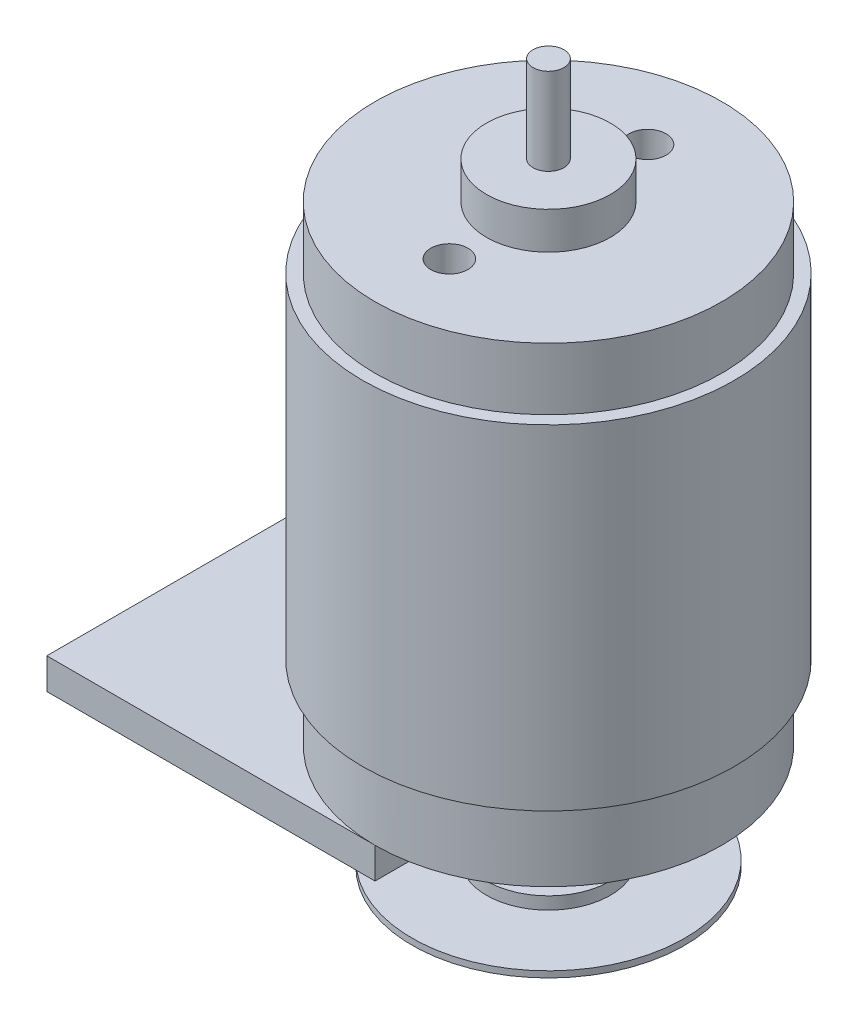
ISO-10303-21;
HEADER;
FILE_DESCRIPTION(('STEP AP214'),'2;1');
FILE_NAME('part.step','',(''),(''),'','','');
FILE_SCHEMA(('AUTOMOTIVE_DESIGN { 1 0 10303 214 1 1 1 1 }'));
ENDSEC;
DATA;
#1=APPLICATION_CONTEXT('core data for automotive mechanical design processes');
#2=APPLICATION_PROTOCOL_DEFINITION('international standard','automotive_design',2000,#1);
#3=PRODUCT_CONTEXT('',#1,'mechanical');
#4=PRODUCT('Part','Part','',(#3));
#5=PRODUCT_RELATED_PRODUCT_CATEGORY('part','',(#4));
#6=PRODUCT_DEFINITION_FORMATION('','',#4);
#7=PRODUCT_DEFINITION_CONTEXT('part definition',#1,'design');
#8=PRODUCT_DEFINITION('design','',#6,#7);
#9=PRODUCT_DEFINITION_SHAPE('','',#8);
#10=(LENGTH_UNIT() NAMED_UNIT(*) SI_UNIT(.MILLI.,.METRE.));
#11=(NAMED_UNIT(*) PLANE_ANGLE_UNIT() SI_UNIT($,.RADIAN.));
#12=(NAMED_UNIT(*) SI_UNIT($,.STERADIAN.) SOLID_ANGLE_UNIT());
#13=UNCERTAINTY_MEASURE_WITH_UNIT(LENGTH_MEASURE(1.E-05),#10,'distance_accuracy_value','');
#14=(GEOMETRIC_REPRESENTATION_CONTEXT(3) GLOBAL_UNCERTAINTY_ASSIGNED_CONTEXT((#13)) GLOBAL_UNIT_ASSIGNED_CONTEXT((#10,
#11,#12)) REPRESENTATION_CONTEXT('',''));
#15=CARTESIAN_POINT('',(0.,0.,0.));
#16=DIRECTION('',(0.,0.,1.));
#17=DIRECTION('',(1.,0.,0.));
#18=AXIS2_PLACEMENT_3D('',#15,#16,#17);
#19=CARTESIAN_POINT('',(0.,-6.,0.));
#20=DIRECTION('',(0.,-1.,0.));
#21=DIRECTION('',(0.,0.,-1.));
#22=AXIS2_PLACEMENT_3D('',#19,#20,#21);
#23=PLANE('',#22);
#24=CARTESIAN_POINT('',(0.,-6.,0.));
#25=DIRECTION('',(0.,-1.,0.));
#26=DIRECTION('',(0.,0.,-1.));
#27=AXIS2_PLACEMENT_3D('',#24,#25,#26);
#28=CIRCLE('',#27,14.);
#29=CARTESIAN_POINT('',(0.,-6.,-14.));
#30=VERTEX_POINT('',#29);
#31=CARTESIAN_POINT('',(0.,-6.,14.));
#32=VERTEX_POINT('',#31);
#33=EDGE_CURVE('E126',#30,#32,#28,.T.);
#34=ORIENTED_EDGE('',*,*,#33,.T.);
#35=DIRECTION('',(0.,0.,1.));
#36=VECTOR('',#35,1.);
#37=CARTESIAN_POINT('',(0.,-6.,14.));
#38=LINE('',#37,#36);
#39=CARTESIAN_POINT('',(0.,-6.,5.));
#40=VERTEX_POINT('',#39);
#41=EDGE_CURVE('E115',#40,#32,#38,.T.);
#42=ORIENTED_EDGE('',*,*,#41,.F.);
#43=CARTESIAN_POINT('',(0.,-6.,0.));
#44=DIRECTION('',(0.,-1.,0.));
#45=DIRECTION('',(0.,0.,-1.));
#46=AXIS2_PLACEMENT_3D('',#43,#44,#45);
#47=CIRCLE('',#46,5.);
#48=CARTESIAN_POINT('',(0.,-6.,-5.));
#49=VERTEX_POINT('',#48);
#50=EDGE_CURVE('E127',#49,#40,#47,.T.);
#51=ORIENTED_EDGE('',*,*,#50,.F.);
#52=EDGE_CURVE('E58',#30,#49,#38,.T.);
#53=ORIENTED_EDGE('',*,*,#52,.F.);
#54=EDGE_LOOP('',(#34,#42,#51,#53));
#55=FACE_BOUND('',#54,.T.);
#56=ADVANCED_FACE('F35',(#55),#23,.T.);
#57=CARTESIAN_POINT('',(0.,-9.,0.));
#58=DIRECTION('',(0.,1.,0.));
#59=DIRECTION('',(0.,0.,1.));
#60=AXIS2_PLACEMENT_3D('',#57,#58,#59);
#61=CYLINDRICAL_SURFACE('',#60,5.);
#62=CARTESIAN_POINT('',(0.,-9.,0.));
#63=DIRECTION('',(0.,-1.,0.));
#64=DIRECTION('',(0.,0.,-1.));
#65=AXIS2_PLACEMENT_3D('',#62,#63,#64);
#66=CIRCLE('',#65,5.);
#67=CARTESIAN_POINT('',(0.,-9.,-5.));
#68=VERTEX_POINT('',#67);
#69=EDGE_CURVE('E118',#68,#68,#66,.T.);
#70=ORIENTED_EDGE('',*,*,#69,.F.);
#71=EDGE_LOOP('',(#70));
#72=FACE_BOUND('',#71,.T.);
#73=DIRECTION('',(0.,1.,0.));
#74=VECTOR('',#73,1.);
#75=CARTESIAN_POINT('',(0.,-9.,5.));
#76=LINE('',#75,#74);
#77=CARTESIAN_POINT('',(0.,-8.5,5.));
#78=VERTEX_POINT('',#77);
#79=EDGE_CURVE('E39',#78,#40,#76,.T.);
#80=ORIENTED_EDGE('',*,*,#79,.F.);
#81=CARTESIAN_POINT('',(0.,-8.5,0.));
#82=DIRECTION('',(0.,1.,0.));
#83=DIRECTION('',(0.,0.,1.));
#84=AXIS2_PLACEMENT_3D('',#81,#82,#83);
#85=CIRCLE('',#84,5.);
#86=CARTESIAN_POINT('',(0.,-8.5,-5.));
#87=VERTEX_POINT('',#86);
#88=EDGE_CURVE('E97',#87,#78,#85,.T.);
#89=ORIENTED_EDGE('',*,*,#88,.F.);
#90=DIRECTION('',(0.,1.,0.));
#91=VECTOR('',#90,1.);
#92=CARTESIAN_POINT('',(0.,-9.,-5.));
#93=LINE('',#92,#91);
#94=EDGE_CURVE('E158',#49,#87,#93,.F.);
#95=ORIENTED_EDGE('',*,*,#94,.F.);
#96=ORIENTED_EDGE('',*,*,#50,.T.);
#97=EDGE_LOOP('',(#80,#89,#95,#96));
#98=FACE_BOUND('',#97,.T.);
#99=ADVANCED_FACE('F208',(#72,#98),#61,.T.);
#100=CARTESIAN_POINT('',(0.,27.,0.));
#101=DIRECTION('',(0.,-1.,0.));
#102=DIRECTION('',(0.,0.,-1.));
#103=AXIS2_PLACEMENT_3D('',#100,#101,#102);
#104=CYLINDRICAL_SURFACE('',#103,15.);
#105=CARTESIAN_POINT('',(0.,27.,0.));
#106=DIRECTION('',(0.,1.,0.));
#107=DIRECTION('',(0.,0.,1.));
#108=AXIS2_PLACEMENT_3D('',#105,#106,#107);
#109=CIRCLE('',#108,15.);
#110=CARTESIAN_POINT('',(0.,27.,15.));
#111=VERTEX_POINT('',#110);
#112=EDGE_CURVE('E153',#111,#111,#109,.T.);
#113=ORIENTED_EDGE('',*,*,#112,.F.);
#114=EDGE_LOOP('',(#113));
#115=FACE_BOUND('',#114,.T.);
#116=CARTESIAN_POINT('',(0.,0.,0.));
#117=DIRECTION('',(0.,1.,0.));
#118=DIRECTION('',(0.,0.,1.));
#119=AXIS2_PLACEMENT_3D('',#116,#117,#118);
#120=CIRCLE('',#119,15.);
#121=CARTESIAN_POINT('',(0.,0.,15.));
#122=VERTEX_POINT('',#121);
#123=EDGE_CURVE('E150',#122,#122,#120,.T.);
#124=ORIENTED_EDGE('',*,*,#123,.T.);
#125=EDGE_LOOP('',(#124));
#126=FACE_BOUND('',#125,.T.);
#127=ADVANCED_FACE('F37',(#115,#126),#104,.T.);
#128=CARTESIAN_POINT('',(0.,27.,0.));
#129=DIRECTION('',(0.,1.,0.));
#130=DIRECTION('',(0.,0.,1.));
#131=AXIS2_PLACEMENT_3D('',#128,#129,#130);
#132=PLANE('',#131);
#133=CARTESIAN_POINT('',(0.,27.,0.));
#134=DIRECTION('',(0.,1.,0.));
#135=DIRECTION('',(0.,0.,1.));
#136=AXIS2_PLACEMENT_3D('',#133,#134,#135);
#137=CIRCLE('',#136,14.);
#138=CARTESIAN_POINT('',(0.,27.,14.));
#139=VERTEX_POINT('',#138);
#140=EDGE_CURVE('E147',#139,#139,#137,.T.);
#141=ORIENTED_EDGE('',*,*,#140,.F.);
#142=EDGE_LOOP('',(#141));
#143=FACE_BOUND('',#142,.T.);
#144=ORIENTED_EDGE('',*,*,#112,.T.);
#145=EDGE_LOOP('',(#144));
#146=FACE_BOUND('',#145,.T.);
#147=ADVANCED_FACE('F244',(#143,#146),#132,.T.);
#148=CARTESIAN_POINT('',(0.,0.,0.));
#149=DIRECTION('',(0.,1.,0.));
#150=DIRECTION('',(0.,0.,1.));
#151=AXIS2_PLACEMENT_3D('',#148,#149,#150);
#152=PLANE('',#151);
#153=CARTESIAN_POINT('',(0.,0.,0.));
#154=DIRECTION('',(0.,-1.,0.));
#155=DIRECTION('',(0.,0.,-1.));
#156=AXIS2_PLACEMENT_3D('',#153,#154,#155);
#157=CIRCLE('',#156,14.);
#158=CARTESIAN_POINT('',(0.,0.,-14.));
#159=VERTEX_POINT('',#158);
#160=EDGE_CURVE('E130',#159,#159,#157,.T.);
#161=ORIENTED_EDGE('',*,*,#160,.F.);
#162=EDGE_LOOP('',(#161));
#163=FACE_BOUND('',#162,.T.);
#164=ORIENTED_EDGE('',*,*,#123,.F.);
#165=EDGE_LOOP('',(#164));
#166=FACE_BOUND('',#165,.T.);
#167=ADVANCED_FACE('F242',(#163,#166),#152,.F.);
#168=CARTESIAN_POINT('',(0.,32.,0.));
#169=DIRECTION('',(0.,-1.,0.));
#170=DIRECTION('',(0.,0.,-1.));
#171=AXIS2_PLACEMENT_3D('',#168,#169,#170);
#172=CYLINDRICAL_SURFACE('',#171,14.);
#173=CARTESIAN_POINT('',(0.,32.,0.));
#174=DIRECTION('',(0.,1.,0.));
#175=DIRECTION('',(0.,0.,1.));
#176=AXIS2_PLACEMENT_3D('',#173,#174,#175);
#177=CIRCLE('',#176,14.);
#178=CARTESIAN_POINT('',(0.,32.,14.));
#179=VERTEX_POINT('',#178);
#180=EDGE_CURVE('E144',#179,#179,#177,.T.);
#181=ORIENTED_EDGE('',*,*,#180,.F.);
#182=EDGE_LOOP('',(#181));
#183=FACE_BOUND('',#182,.T.);
#184=ORIENTED_EDGE('',*,*,#140,.T.);
#185=EDGE_LOOP('',(#184));
#186=FACE_BOUND('',#185,.T.);
#187=ADVANCED_FACE('F238',(#183,#186),#172,.T.);
#188=CARTESIAN_POINT('',(0.,32.,0.));
#189=DIRECTION('',(0.,1.,0.));
#190=DIRECTION('',(0.,0.,1.));
#191=AXIS2_PLACEMENT_3D('',#188,#189,#190);
#192=PLANE('',#191);
#193=CARTESIAN_POINT('',(0.,32.,-8.));
#194=DIRECTION('',(0.,1.,0.));
#195=DIRECTION('',(0.,0.,1.));
#196=AXIS2_PLACEMENT_3D('',#193,#194,#195);
#197=CIRCLE('',#196,1.5);
#198=CARTESIAN_POINT('',(0.,32.,-6.5));
#199=VERTEX_POINT('',#198);
#200=EDGE_CURVE('E525',#199,#199,#197,.T.);
#201=ORIENTED_EDGE('',*,*,#200,.F.);
#202=EDGE_LOOP('',(#201));
#203=FACE_BOUND('',#202,.T.);
#204=CARTESIAN_POINT('',(0.,32.,8.));
#205=DIRECTION('',(0.,1.,0.));
#206=DIRECTION('',(0.,0.,1.));
#207=AXIS2_PLACEMENT_3D('',#204,#205,#206);
#208=CIRCLE('',#207,1.5);
#209=CARTESIAN_POINT('',(0.,32.,9.5));
#210=VERTEX_POINT('',#209);
#211=EDGE_CURVE('E536',#210,#210,#208,.T.);
#212=ORIENTED_EDGE('',*,*,#211,.F.);
#213=EDGE_LOOP('',(#212));
#214=FACE_BOUND('',#213,.T.);
#215=CARTESIAN_POINT('',(0.,32.,0.));
#216=DIRECTION('',(0.,1.,0.));
#217=DIRECTION('',(0.,0.,1.));
#218=AXIS2_PLACEMENT_3D('',#215,#216,#217);
#219=CIRCLE('',#218,5.);
#220=CARTESIAN_POINT('',(0.,32.,5.));
#221=VERTEX_POINT('',#220);
#222=EDGE_CURVE('E141',#221,#221,#219,.T.);
#223=ORIENTED_EDGE('',*,*,#222,.F.);
#224=EDGE_LOOP('',(#223));
#225=FACE_BOUND('',#224,.T.);
#226=ORIENTED_EDGE('',*,*,#180,.T.);
#227=EDGE_LOOP('',(#226));
#228=FACE_BOUND('',#227,.T.);
#229=ADVANCED_FACE('F234',(#203,#214,#225,#228),#192,.T.);
#230=CARTESIAN_POINT('',(0.,35.,0.));
#231=DIRECTION('',(0.,-1.,0.));
#232=DIRECTION('',(0.,0.,-1.));
#233=AXIS2_PLACEMENT_3D('',#230,#231,#232);
#234=CYLINDRICAL_SURFACE('',#233,5.);
#235=CARTESIAN_POINT('',(0.,35.,0.));
#236=DIRECTION('',(0.,1.,0.));
#237=DIRECTION('',(0.,0.,1.));
#238=AXIS2_PLACEMENT_3D('',#235,#236,#237);
#239=CIRCLE('',#238,5.);
#240=CARTESIAN_POINT('',(0.,35.,5.));
#241=VERTEX_POINT('',#240);
#242=EDGE_CURVE('E138',#241,#241,#239,.T.);
#243=ORIENTED_EDGE('',*,*,#242,.F.);
#244=EDGE_LOOP('',(#243));
#245=FACE_BOUND('',#244,.T.);
#246=ORIENTED_EDGE('',*,*,#222,.T.);
#247=EDGE_LOOP('',(#246));
#248=FACE_BOUND('',#247,.T.);
#249=ADVANCED_FACE('F230',(#245,#248),#234,.T.);
#250=CARTESIAN_POINT('',(0.,35.,0.));
#251=DIRECTION('',(0.,1.,0.));
#252=DIRECTION('',(0.,0.,1.));
#253=AXIS2_PLACEMENT_3D('',#250,#251,#252);
#254=PLANE('',#253);
#255=CARTESIAN_POINT('',(0.,35.,0.));
#256=DIRECTION('',(0.,1.,0.));
#257=DIRECTION('',(0.,0.,1.));
#258=AXIS2_PLACEMENT_3D('',#255,#256,#257);
#259=CIRCLE('',#258,1.25);
#260=CARTESIAN_POINT('',(0.,35.,1.25));
#261=VERTEX_POINT('',#260);
#262=EDGE_CURVE('E135',#261,#261,#259,.T.);
#263=ORIENTED_EDGE('',*,*,#262,.F.);
#264=EDGE_LOOP('',(#263));
#265=FACE_BOUND('',#264,.T.);
#266=ORIENTED_EDGE('',*,*,#242,.T.);
#267=EDGE_LOOP('',(#266));
#268=FACE_BOUND('',#267,.T.);
#269=ADVANCED_FACE('F226',(#265,#268),#254,.T.);
#270=CARTESIAN_POINT('',(0.,42.,0.));
#271=DIRECTION('',(0.,-1.,0.));
#272=DIRECTION('',(0.,0.,-1.));
#273=AXIS2_PLACEMENT_3D('',#270,#271,#272);
#274=CYLINDRICAL_SURFACE('',#273,1.25);
#275=CARTESIAN_POINT('',(0.,42.,0.));
#276=DIRECTION('',(0.,1.,0.));
#277=DIRECTION('',(0.,0.,1.));
#278=AXIS2_PLACEMENT_3D('',#275,#276,#277);
#279=CIRCLE('',#278,1.25);
#280=CARTESIAN_POINT('',(0.,42.,1.25));
#281=VERTEX_POINT('',#280);
#282=EDGE_CURVE('E132',#281,#281,#279,.T.);
#283=ORIENTED_EDGE('',*,*,#282,.F.);
#284=EDGE_LOOP('',(#283));
#285=FACE_BOUND('',#284,.T.);
#286=ORIENTED_EDGE('',*,*,#262,.T.);
#287=EDGE_LOOP('',(#286));
#288=FACE_BOUND('',#287,.T.);
#289=ADVANCED_FACE('F222',(#285,#288),#274,.T.);
#290=CARTESIAN_POINT('',(0.,42.,0.));
#291=DIRECTION('',(0.,1.,0.));
#292=DIRECTION('',(0.,0.,1.));
#293=AXIS2_PLACEMENT_3D('',#290,#291,#292);
#294=PLANE('',#293);
#295=ORIENTED_EDGE('',*,*,#282,.T.);
#296=EDGE_LOOP('',(#295));
#297=FACE_BOUND('',#296,.T.);
#298=ADVANCED_FACE('F219',(#297),#294,.T.);
#299=CARTESIAN_POINT('',(0.,-6.,0.));
#300=DIRECTION('',(0.,1.,0.));
#301=DIRECTION('',(0.,0.,1.));
#302=AXIS2_PLACEMENT_3D('',#299,#300,#301);
#303=CYLINDRICAL_SURFACE('',#302,14.);
#304=ORIENTED_EDGE('',*,*,#33,.F.);
#305=CARTESIAN_POINT('',(0.,-6.,0.));
#306=DIRECTION('',(0.,1.,0.));
#307=DIRECTION('',(0.,0.,1.));
#308=AXIS2_PLACEMENT_3D('',#305,#306,#307);
#309=CIRCLE('',#308,14.);
#310=EDGE_CURVE('E51',#30,#32,#309,.T.);
#311=ORIENTED_EDGE('',*,*,#310,.T.);
#312=EDGE_LOOP('',(#304,#311));
#313=FACE_BOUND('',#312,.T.);
#314=ORIENTED_EDGE('',*,*,#160,.T.);
#315=EDGE_LOOP('',(#314));
#316=FACE_BOUND('',#315,.T.);
#317=ADVANCED_FACE('F216',(#313,#316),#303,.T.);
#318=CARTESIAN_POINT('',(0.,-9.,0.));
#319=DIRECTION('',(0.,-1.,0.));
#320=DIRECTION('',(0.,0.,-1.));
#321=AXIS2_PLACEMENT_3D('',#318,#319,#320);
#322=PLANE('',#321);
#323=CARTESIAN_POINT('',(0.,-9.,0.));
#324=DIRECTION('',(0.,-1.,0.));
#325=DIRECTION('',(0.,0.,-1.));
#326=AXIS2_PLACEMENT_3D('',#323,#324,#325);
#327=CIRCLE('',#326,1.25);
#328=CARTESIAN_POINT('',(0.,-9.,-1.25));
#329=VERTEX_POINT('',#328);
#330=EDGE_CURVE('E162',#329,#329,#327,.T.);
#331=ORIENTED_EDGE('',*,*,#330,.F.);
#332=EDGE_LOOP('',(#331));
#333=FACE_BOUND('',#332,.T.);
#334=ORIENTED_EDGE('',*,*,#69,.T.);
#335=EDGE_LOOP('',(#334));
#336=FACE_BOUND('',#335,.T.);
#337=ADVANCED_FACE('F205',(#333,#336),#322,.T.);
#338=CARTESIAN_POINT('',(0.,-8.5,14.));
#339=DIRECTION('',(-1.,0.,0.));
#340=DIRECTION('',(0.,0.,1.));
#341=AXIS2_PLACEMENT_3D('',#338,#339,#340);
#342=PLANE('',#341);
#343=DIRECTION('',(0.,0.,1.));
#344=VECTOR('',#343,1.);
#345=CARTESIAN_POINT('',(0.,-8.5,14.));
#346=LINE('',#345,#344);
#347=CARTESIAN_POINT('',(0.,-8.5,14.));
#348=VERTEX_POINT('',#347);
#349=EDGE_CURVE('E91',#78,#348,#346,.T.);
#350=ORIENTED_EDGE('',*,*,#349,.F.);
#351=ORIENTED_EDGE('',*,*,#79,.T.);
#352=ORIENTED_EDGE('',*,*,#41,.T.);
#353=DIRECTION('',(0.,1.,0.));
#354=VECTOR('',#353,1.);
#355=CARTESIAN_POINT('',(0.,-8.5,14.));
#356=LINE('',#355,#354);
#357=EDGE_CURVE('E107',#348,#32,#356,.T.);
#358=ORIENTED_EDGE('',*,*,#357,.F.);
#359=EDGE_LOOP('',(#350,#351,#352,#358));
#360=FACE_BOUND('',#359,.T.);
#361=ADVANCED_FACE('F114',(#360),#342,.F.);
#362=ORIENTED_EDGE('',*,*,#52,.T.);
#363=ORIENTED_EDGE('',*,*,#94,.T.);
#364=CARTESIAN_POINT('',(0.,-8.5,-14.));
#365=VERTEX_POINT('',#364);
#366=EDGE_CURVE('E101',#365,#87,#346,.T.);
#367=ORIENTED_EDGE('',*,*,#366,.F.);
#368=DIRECTION('',(0.,1.,0.));
#369=VECTOR('',#368,1.);
#370=CARTESIAN_POINT('',(0.,-8.5,-14.));
#371=LINE('',#370,#369);
#372=EDGE_CURVE('E176',#365,#30,#371,.T.);
#373=ORIENTED_EDGE('',*,*,#372,.T.);
#374=EDGE_LOOP('',(#362,#363,#367,#373));
#375=FACE_BOUND('',#374,.T.);
#376=ADVANCED_FACE('F197',(#375),#342,.F.);
#377=CARTESIAN_POINT('',(0.,-8.5,14.));
#378=DIRECTION('',(0.,0.,-1.));
#379=DIRECTION('',(-1.,0.,0.));
#380=AXIS2_PLACEMENT_3D('',#377,#378,#379);
#381=PLANE('',#380);
#382=DIRECTION('',(-1.,0.,0.));
#383=VECTOR('',#382,1.);
#384=CARTESIAN_POINT('',(0.,-6.,14.));
#385=LINE('',#384,#383);
#386=CARTESIAN_POINT('',(-26.5,-6.,14.));
#387=VERTEX_POINT('',#386);
#388=EDGE_CURVE('E178',#32,#387,#385,.T.);
#389=ORIENTED_EDGE('',*,*,#388,.T.);
#390=DIRECTION('',(0.,1.,0.));
#391=VECTOR('',#390,1.);
#392=CARTESIAN_POINT('',(-26.5,-8.5,14.));
#393=LINE('',#392,#391);
#394=CARTESIAN_POINT('',(-26.5,-8.5,14.));
#395=VERTEX_POINT('',#394);
#396=EDGE_CURVE('E109',#395,#387,#393,.T.);
#397=ORIENTED_EDGE('',*,*,#396,.F.);
#398=DIRECTION('',(-1.,0.,0.));
#399=VECTOR('',#398,1.);
#400=CARTESIAN_POINT('',(0.,-8.5,14.));
#401=LINE('',#400,#399);
#402=EDGE_CURVE('E95',#348,#395,#401,.T.);
#403=ORIENTED_EDGE('',*,*,#402,.F.);
#404=ORIENTED_EDGE('',*,*,#357,.T.);
#405=EDGE_LOOP('',(#389,#397,#403,#404));
#406=FACE_BOUND('',#405,.T.);
#407=ADVANCED_FACE('F106',(#406),#381,.F.);
#408=CARTESIAN_POINT('',(-26.5,-8.5,14.));
#409=DIRECTION('',(1.,0.,0.));
#410=DIRECTION('',(0.,0.,-1.));
#411=AXIS2_PLACEMENT_3D('',#408,#409,#410);
#412=PLANE('',#411);
#413=DIRECTION('',(0.,0.,-1.));
#414=VECTOR('',#413,1.);
#415=CARTESIAN_POINT('',(-26.5,-6.,14.));
#416=LINE('',#415,#414);
#417=CARTESIAN_POINT('',(-26.5,-6.,-14.));
#418=VERTEX_POINT('',#417);
#419=EDGE_CURVE('E180',#387,#418,#416,.T.);
#420=ORIENTED_EDGE('',*,*,#419,.T.);
#421=DIRECTION('',(0.,1.,0.));
#422=VECTOR('',#421,1.);
#423=CARTESIAN_POINT('',(-26.5,-8.5,-14.));
#424=LINE('',#423,#422);
#425=CARTESIAN_POINT('',(-26.5,-8.5,-14.));
#426=VERTEX_POINT('',#425);
#427=EDGE_CURVE('E120',#426,#418,#424,.T.);
#428=ORIENTED_EDGE('',*,*,#427,.F.);
#429=DIRECTION('',(0.,0.,-1.));
#430=VECTOR('',#429,1.);
#431=CARTESIAN_POINT('',(-26.5,-8.5,14.));
#432=LINE('',#431,#430);
#433=EDGE_CURVE('E111',#395,#426,#432,.T.);
#434=ORIENTED_EDGE('',*,*,#433,.F.);
#435=ORIENTED_EDGE('',*,*,#396,.T.);
#436=EDGE_LOOP('',(#420,#428,#434,#435));
#437=FACE_BOUND('',#436,.T.);
#438=ADVANCED_FACE('F196',(#437),#412,.F.);
#439=CARTESIAN_POINT('',(0.,-8.5,-14.));
#440=DIRECTION('',(0.,0.,1.));
#441=DIRECTION('',(1.,0.,0.));
#442=AXIS2_PLACEMENT_3D('',#439,#440,#441);
#443=PLANE('',#442);
#444=DIRECTION('',(1.,0.,0.));
#445=VECTOR('',#444,1.);
#446=CARTESIAN_POINT('',(0.,-6.,-14.));
#447=LINE('',#446,#445);
#448=EDGE_CURVE('E102',#418,#30,#447,.T.);
#449=ORIENTED_EDGE('',*,*,#448,.T.);
#450=ORIENTED_EDGE('',*,*,#372,.F.);
#451=DIRECTION('',(1.,0.,0.));
#452=VECTOR('',#451,1.);
#453=CARTESIAN_POINT('',(0.,-8.5,-14.));
#454=LINE('',#453,#452);
#455=EDGE_CURVE('E174',#426,#365,#454,.T.);
#456=ORIENTED_EDGE('',*,*,#455,.F.);
#457=ORIENTED_EDGE('',*,*,#427,.T.);
#458=EDGE_LOOP('',(#449,#450,#456,#457));
#459=FACE_BOUND('',#458,.T.);
#460=ADVANCED_FACE('F190',(#459),#443,.F.);
#461=CARTESIAN_POINT('',(0.,-8.5,0.));
#462=DIRECTION('',(0.,1.,0.));
#463=DIRECTION('',(0.,0.,1.));
#464=AXIS2_PLACEMENT_3D('',#461,#462,#463);
#465=PLANE('',#464);
#466=ORIENTED_EDGE('',*,*,#366,.T.);
#467=ORIENTED_EDGE('',*,*,#88,.T.);
#468=ORIENTED_EDGE('',*,*,#349,.T.);
#469=ORIENTED_EDGE('',*,*,#402,.T.);
#470=ORIENTED_EDGE('',*,*,#433,.T.);
#471=ORIENTED_EDGE('',*,*,#455,.T.);
#472=EDGE_LOOP('',(#466,#467,#468,#469,#470,#471));
#473=FACE_BOUND('',#472,.T.);
#474=ADVANCED_FACE('F94',(#473),#465,.F.);
#475=CARTESIAN_POINT('',(0.,-6.,0.));
#476=DIRECTION('',(0.,1.,0.));
#477=DIRECTION('',(0.,0.,1.));
#478=AXIS2_PLACEMENT_3D('',#475,#476,#477);
#479=PLANE('',#478);
#480=ORIENTED_EDGE('',*,*,#310,.F.);
#481=ORIENTED_EDGE('',*,*,#448,.F.);
#482=ORIENTED_EDGE('',*,*,#419,.F.);
#483=ORIENTED_EDGE('',*,*,#388,.F.);
#484=EDGE_LOOP('',(#480,#481,#482,#483));
#485=FACE_BOUND('',#484,.T.);
#486=ADVANCED_FACE('F195',(#485),#479,.T.);
#487=CARTESIAN_POINT('',(0.,-13.,0.));
#488=DIRECTION('',(0.,1.,0.));
#489=DIRECTION('',(0.,0.,1.));
#490=AXIS2_PLACEMENT_3D('',#487,#488,#489);
#491=CYLINDRICAL_SURFACE('',#490,1.25);
#492=CARTESIAN_POINT('',(0.,-13.,0.));
#493=DIRECTION('',(0.,-1.,0.));
#494=DIRECTION('',(0.,0.,-1.));
#495=AXIS2_PLACEMENT_3D('',#492,#493,#494);
#496=CIRCLE('',#495,1.25);
#497=CARTESIAN_POINT('',(0.,-13.,-1.25));
#498=VERTEX_POINT('',#497);
#499=EDGE_CURVE('E170',#498,#498,#496,.T.);
#500=ORIENTED_EDGE('',*,*,#499,.F.);
#501=EDGE_LOOP('',(#500));
#502=FACE_BOUND('',#501,.T.);
#503=ORIENTED_EDGE('',*,*,#330,.T.);
#504=EDGE_LOOP('',(#503));
#505=FACE_BOUND('',#504,.T.);
#506=ADVANCED_FACE('F367',(#502,#505),#491,.T.);
#507=CARTESIAN_POINT('',(0.,-14.,0.));
#508=DIRECTION('',(0.,1.,0.));
#509=DIRECTION('',(0.,0.,1.));
#510=AXIS2_PLACEMENT_3D('',#507,#508,#509);
#511=CYLINDRICAL_SURFACE('',#510,5.);
#512=CARTESIAN_POINT('',(0.,-14.,0.));
#513=DIRECTION('',(0.,-1.,0.));
#514=DIRECTION('',(0.,0.,-1.));
#515=AXIS2_PLACEMENT_3D('',#512,#513,#514);
#516=CIRCLE('',#515,5.);
#517=CARTESIAN_POINT('',(0.,-14.,-5.));
#518=VERTEX_POINT('',#517);
#519=EDGE_CURVE('E548',#518,#518,#516,.T.);
#520=ORIENTED_EDGE('',*,*,#519,.F.);
#521=EDGE_LOOP('',(#520));
#522=FACE_BOUND('',#521,.T.);
#523=CARTESIAN_POINT('',(0.,-13.,0.));
#524=DIRECTION('',(0.,-1.,0.));
#525=DIRECTION('',(0.,0.,-1.));
#526=AXIS2_PLACEMENT_3D('',#523,#524,#525);
#527=CIRCLE('',#526,5.);
#528=CARTESIAN_POINT('',(0.,-13.,-5.));
#529=VERTEX_POINT('',#528);
#530=EDGE_CURVE('E545',#529,#529,#527,.T.);
#531=ORIENTED_EDGE('',*,*,#530,.T.);
#532=EDGE_LOOP('',(#531));
#533=FACE_BOUND('',#532,.T.);
#534=ADVANCED_FACE('F382',(#522,#533),#511,.T.);
#535=CARTESIAN_POINT('',(0.,-13.,0.));
#536=DIRECTION('',(0.,-1.,0.));
#537=DIRECTION('',(0.,0.,-1.));
#538=AXIS2_PLACEMENT_3D('',#535,#536,#537);
#539=PLANE('',#538);
#540=ORIENTED_EDGE('',*,*,#499,.T.);
#541=EDGE_LOOP('',(#540));
#542=FACE_BOUND('',#541,.T.);
#543=ORIENTED_EDGE('',*,*,#530,.F.);
#544=EDGE_LOOP('',(#543));
#545=FACE_BOUND('',#544,.T.);
#546=ADVANCED_FACE('F392',(#542,#545),#539,.F.);
#547=CARTESIAN_POINT('',(0.,-14.5,0.));
#548=DIRECTION('',(0.,1.,0.));
#549=DIRECTION('',(0.,0.,1.));
#550=AXIS2_PLACEMENT_3D('',#547,#548,#549);
#551=CYLINDRICAL_SURFACE('',#550,11.);
#552=CARTESIAN_POINT('',(0.,-14.5,0.));
#553=DIRECTION('',(0.,-1.,0.));
#554=DIRECTION('',(0.,0.,-1.));
#555=AXIS2_PLACEMENT_3D('',#552,#553,#554);
#556=CIRCLE('',#555,11.);
#557=CARTESIAN_POINT('',(0.,-14.5,-11.));
#558=VERTEX_POINT('',#557);
#559=EDGE_CURVE('E542',#558,#558,#556,.T.);
#560=ORIENTED_EDGE('',*,*,#559,.F.);
#561=EDGE_LOOP('',(#560));
#562=FACE_BOUND('',#561,.T.);
#563=CARTESIAN_POINT('',(0.,-14.,0.));
#564=DIRECTION('',(0.,-1.,0.));
#565=DIRECTION('',(0.,0.,-1.));
#566=AXIS2_PLACEMENT_3D('',#563,#564,#565);
#567=CIRCLE('',#566,11.);
#568=CARTESIAN_POINT('',(0.,-14.,-11.));
#569=VERTEX_POINT('',#568);
#570=EDGE_CURVE('E540',#569,#569,#567,.T.);
#571=ORIENTED_EDGE('',*,*,#570,.T.);
#572=EDGE_LOOP('',(#571));
#573=FACE_BOUND('',#572,.T.);
#574=ADVANCED_FACE('F402',(#562,#573),#551,.T.);
#575=CARTESIAN_POINT('',(0.,-14.5,0.));
#576=DIRECTION('',(0.,-1.,0.));
#577=DIRECTION('',(0.,0.,-1.));
#578=AXIS2_PLACEMENT_3D('',#575,#576,#577);
#579=PLANE('',#578);
#580=CARTESIAN_POINT('',(0.,-14.5,0.));
#581=DIRECTION('',(0.,-1.,0.));
#582=DIRECTION('',(0.,0.,-1.));
#583=AXIS2_PLACEMENT_3D('',#580,#581,#582);
#584=CIRCLE('',#583,5.);
#585=CARTESIAN_POINT('',(0.,-14.5,-5.));
#586=VERTEX_POINT('',#585);
#587=EDGE_CURVE('E44',#586,#586,#584,.T.);
#588=ORIENTED_EDGE('',*,*,#587,.F.);
#589=EDGE_LOOP('',(#588));
#590=FACE_BOUND('',#589,.T.);
#591=ORIENTED_EDGE('',*,*,#559,.T.);
#592=EDGE_LOOP('',(#591));
#593=FACE_BOUND('',#592,.T.);
#594=ADVANCED_FACE('F412',(#590,#593),#579,.T.);
#595=CARTESIAN_POINT('',(0.,-14.,0.));
#596=DIRECTION('',(0.,-1.,0.));
#597=DIRECTION('',(0.,0.,-1.));
#598=AXIS2_PLACEMENT_3D('',#595,#596,#597);
#599=PLANE('',#598);
#600=ORIENTED_EDGE('',*,*,#519,.T.);
#601=EDGE_LOOP('',(#600));
#602=FACE_BOUND('',#601,.T.);
#603=ORIENTED_EDGE('',*,*,#570,.F.);
#604=EDGE_LOOP('',(#603));
#605=FACE_BOUND('',#604,.T.);
#606=ADVANCED_FACE('F420',(#602,#605),#599,.F.);
#607=CARTESIAN_POINT('',(0.,-15.5,0.));
#608=DIRECTION('',(0.,1.,0.));
#609=DIRECTION('',(0.,0.,1.));
#610=AXIS2_PLACEMENT_3D('',#607,#608,#609);
#611=CYLINDRICAL_SURFACE('',#610,5.);
#612=CARTESIAN_POINT('',(0.,-15.5,0.));
#613=DIRECTION('',(0.,-1.,0.));
#614=DIRECTION('',(0.,0.,-1.));
#615=AXIS2_PLACEMENT_3D('',#612,#613,#614);
#616=CIRCLE('',#615,5.);
#617=CARTESIAN_POINT('',(0.,-15.5,-5.));
#618=VERTEX_POINT('',#617);
#619=EDGE_CURVE('E528',#618,#618,#616,.T.);
#620=ORIENTED_EDGE('',*,*,#619,.F.);
#621=EDGE_LOOP('',(#620));
#622=FACE_BOUND('',#621,.T.);
#623=ORIENTED_EDGE('',*,*,#587,.T.);
#624=EDGE_LOOP('',(#623));
#625=FACE_BOUND('',#624,.T.);
#626=ADVANCED_FACE('F425',(#622,#625),#611,.T.);
#627=CARTESIAN_POINT('',(0.,-15.5,0.));
#628=DIRECTION('',(0.,-1.,0.));
#629=DIRECTION('',(0.,0.,-1.));
#630=AXIS2_PLACEMENT_3D('',#627,#628,#629);
#631=PLANE('',#630);
#632=CARTESIAN_POINT('',(0.,-15.5,0.));
#633=DIRECTION('',(0.,-1.,0.));
#634=DIRECTION('',(0.,0.,-1.));
#635=AXIS2_PLACEMENT_3D('',#632,#633,#634);
#636=CIRCLE('',#635,1.25);
#637=CARTESIAN_POINT('',(0.,-15.5,-1.25));
#638=VERTEX_POINT('',#637);
#639=EDGE_CURVE('E11',#638,#638,#636,.T.);
#640=ORIENTED_EDGE('',*,*,#639,.F.);
#641=EDGE_LOOP('',(#640));
#642=FACE_BOUND('',#641,.T.);
#643=ORIENTED_EDGE('',*,*,#619,.T.);
#644=EDGE_LOOP('',(#643));
#645=FACE_BOUND('',#644,.T.);
#646=ADVANCED_FACE('F442',(#642,#645),#631,.T.);
#647=CARTESIAN_POINT('',(0.,-18.5,0.));
#648=DIRECTION('',(0.,1.,0.));
#649=DIRECTION('',(0.,0.,1.));
#650=AXIS2_PLACEMENT_3D('',#647,#648,#649);
#651=CYLINDRICAL_SURFACE('',#650,1.25);
#652=CARTESIAN_POINT('',(0.,-18.5,0.));
#653=DIRECTION('',(0.,-1.,0.));
#654=DIRECTION('',(0.,0.,-1.));
#655=AXIS2_PLACEMENT_3D('',#652,#653,#654);
#656=CIRCLE('',#655,1.25);
#657=CARTESIAN_POINT('',(0.,-18.5,-1.25));
#658=VERTEX_POINT('',#657);
#659=EDGE_CURVE('E524',#658,#658,#656,.T.);
#660=ORIENTED_EDGE('',*,*,#659,.F.);
#661=EDGE_LOOP('',(#660));
#662=FACE_BOUND('',#661,.T.);
#663=ORIENTED_EDGE('',*,*,#639,.T.);
#664=EDGE_LOOP('',(#663));
#665=FACE_BOUND('',#664,.T.);
#666=ADVANCED_FACE('F452',(#662,#665),#651,.T.);
#667=CARTESIAN_POINT('',(0.,-18.5,0.));
#668=DIRECTION('',(0.,-1.,0.));
#669=DIRECTION('',(0.,0.,-1.));
#670=AXIS2_PLACEMENT_3D('',#667,#668,#669);
#671=PLANE('',#670);
#672=ORIENTED_EDGE('',*,*,#659,.T.);
#673=EDGE_LOOP('',(#672));
#674=FACE_BOUND('',#673,.T.);
#675=ADVANCED_FACE('F462',(#674),#671,.T.);
#676=CARTESIAN_POINT('',(0.,12.,8.));
#677=DIRECTION('',(0.,1.,0.));
#678=DIRECTION('',(0.,0.,1.));
#679=AXIS2_PLACEMENT_3D('',#676,#677,#678);
#680=CYLINDRICAL_SURFACE('',#679,1.5);
#681=CARTESIAN_POINT('',(0.,12.,8.));
#682=DIRECTION('',(0.,1.,0.));
#683=DIRECTION('',(0.,0.,1.));
#684=AXIS2_PLACEMENT_3D('',#681,#682,#683);
#685=CIRCLE('',#684,1.5);
#686=CARTESIAN_POINT('',(0.,12.,9.5));
#687=VERTEX_POINT('',#686);
#688=EDGE_CURVE('E531',#687,#687,#685,.T.);
#689=ORIENTED_EDGE('',*,*,#688,.F.);
#690=EDGE_LOOP('',(#689));
#691=FACE_BOUND('',#690,.T.);
#692=ORIENTED_EDGE('',*,*,#211,.T.);
#693=EDGE_LOOP('',(#692));
#694=FACE_BOUND('',#693,.T.);
#695=ADVANCED_FACE('F472',(#691,#694),#680,.F.);
#696=CARTESIAN_POINT('',(0.,12.,8.));
#697=DIRECTION('',(0.,1.,0.));
#698=DIRECTION('',(0.,0.,1.));
#699=AXIS2_PLACEMENT_3D('',#696,#697,#698);
#700=PLANE('',#699);
#701=ORIENTED_EDGE('',*,*,#688,.T.);
#702=EDGE_LOOP('',(#701));
#703=FACE_BOUND('',#702,.T.);
#704=ADVANCED_FACE('F487',(#703),#700,.T.);
#705=CARTESIAN_POINT('',(0.,12.,-8.));
#706=DIRECTION('',(0.,1.,0.));
#707=DIRECTION('',(0.,0.,1.));
#708=AXIS2_PLACEMENT_3D('',#705,#706,#707);
#709=CYLINDRICAL_SURFACE('',#708,1.5);
#710=CARTESIAN_POINT('',(0.,12.,-8.));
#711=DIRECTION('',(0.,1.,0.));
#712=DIRECTION('',(0.,0.,1.));
#713=AXIS2_PLACEMENT_3D('',#710,#711,#712);
#714=CIRCLE('',#713,1.5);
#715=CARTESIAN_POINT('',(0.,12.,-6.5));
#716=VERTEX_POINT('',#715);
#717=EDGE_CURVE('E523',#716,#716,#714,.T.);
#718=ORIENTED_EDGE('',*,*,#717,.F.);
#719=EDGE_LOOP('',(#718));
#720=FACE_BOUND('',#719,.T.);
#721=ORIENTED_EDGE('',*,*,#200,.T.);
#722=EDGE_LOOP('',(#721));
#723=FACE_BOUND('',#722,.T.);
#724=ADVANCED_FACE('F497',(#720,#723),#709,.F.);
#725=CARTESIAN_POINT('',(0.,12.,-8.));
#726=DIRECTION('',(0.,1.,0.));
#727=DIRECTION('',(0.,0.,1.));
#728=AXIS2_PLACEMENT_3D('',#725,#726,#727);
#729=PLANE('',#728);
#730=ORIENTED_EDGE('',*,*,#717,.T.);
#731=EDGE_LOOP('',(#730));
#732=FACE_BOUND('',#731,.T.);
#733=ADVANCED_FACE('F507',(#732),#729,.T.);
#734=CLOSED_SHELL('',(#56,#99,#127,#147,#167,#187,#229,#249,#269,#289,#298,#317,#337,#361,#376,
#407,#438,#460,#474,#486,#506,#534,#546,#574,#594,#606,#626,#646,#666,#675,#695,#704,#724,#733));
#735=MANIFOLD_SOLID_BREP('B2',#734);
#736=ADVANCED_BREP_SHAPE_REPRESENTATION('',(#18,#735),#14);
#737=SHAPE_DEFINITION_REPRESENTATION(#9,#736);
ENDSEC;
END-ISO-10303-21;
